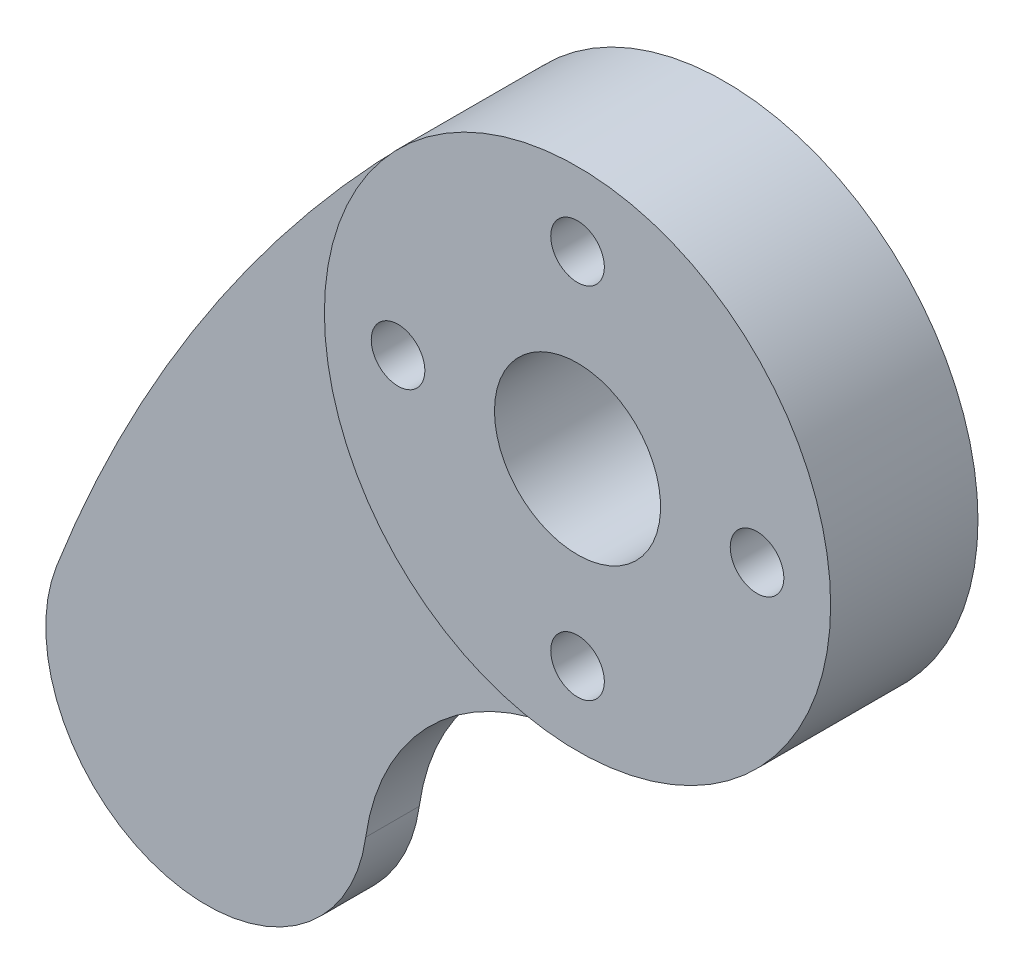
ISO-10303-21;
HEADER;
FILE_DESCRIPTION(('STEP AP214'),'2;1');
FILE_NAME('part.step','',(''),(''),'','','');
FILE_SCHEMA(('AUTOMOTIVE_DESIGN { 1 0 10303 214 1 1 1 1 }'));
ENDSEC;
DATA;
#1=APPLICATION_CONTEXT('core data for automotive mechanical design processes');
#2=APPLICATION_PROTOCOL_DEFINITION('international standard','automotive_design',2000,#1);
#3=PRODUCT_CONTEXT('',#1,'mechanical');
#4=PRODUCT('Part','Part','',(#3));
#5=PRODUCT_RELATED_PRODUCT_CATEGORY('part','',(#4));
#6=PRODUCT_DEFINITION_FORMATION('','',#4);
#7=PRODUCT_DEFINITION_CONTEXT('part definition',#1,'design');
#8=PRODUCT_DEFINITION('design','',#6,#7);
#9=PRODUCT_DEFINITION_SHAPE('','',#8);
#10=(LENGTH_UNIT() NAMED_UNIT(*) SI_UNIT(.MILLI.,.METRE.));
#11=(NAMED_UNIT(*) PLANE_ANGLE_UNIT() SI_UNIT($,.RADIAN.));
#12=(NAMED_UNIT(*) SI_UNIT($,.STERADIAN.) SOLID_ANGLE_UNIT());
#13=UNCERTAINTY_MEASURE_WITH_UNIT(LENGTH_MEASURE(1.E-05),#10,'distance_accuracy_value','');
#14=(GEOMETRIC_REPRESENTATION_CONTEXT(3) GLOBAL_UNCERTAINTY_ASSIGNED_CONTEXT((#13)) GLOBAL_UNIT_ASSIGNED_CONTEXT((#10,
#11,#12)) REPRESENTATION_CONTEXT('',''));
#15=CARTESIAN_POINT('',(0.,0.,0.));
#16=DIRECTION('',(0.,0.,1.));
#17=DIRECTION('',(1.,0.,0.));
#18=AXIS2_PLACEMENT_3D('',#15,#16,#17);
#19=CARTESIAN_POINT('',(0.,0.,3.175));
#20=DIRECTION('',(0.,0.,1.));
#21=DIRECTION('',(1.,0.,0.));
#22=AXIS2_PLACEMENT_3D('',#19,#20,#21);
#23=PLANE('',#22);
#24=CARTESIAN_POINT('',(104.489250000002,43.4974999999998,3.175));
#25=DIRECTION('',(0.,0.,1.));
#26=DIRECTION('',(1.,0.,0.));
#27=AXIS2_PLACEMENT_3D('',#24,#25,#26);
#28=CIRCLE('',#27,1.26999999998563);
#29=CARTESIAN_POINT('',(103.219250000017,43.4974999999998,3.175));
#30=VERTEX_POINT('',#29);
#31=EDGE_CURVE('E140',#30,#30,#28,.T.);
#32=ORIENTED_EDGE('',*,*,#31,.F.);
#33=EDGE_LOOP('',(#32));
#34=FACE_BOUND('',#33,.T.);
#35=CARTESIAN_POINT('',(104.489250000002,60.5154999999998,3.175));
#36=DIRECTION('',(0.,0.,1.));
#37=DIRECTION('',(1.,0.,0.));
#38=AXIS2_PLACEMENT_3D('',#35,#36,#37);
#39=CIRCLE('',#38,1.26999999998563);
#40=CARTESIAN_POINT('',(103.219250000017,60.5154999999998,3.175));
#41=VERTEX_POINT('',#40);
#42=EDGE_CURVE('E134',#41,#41,#39,.T.);
#43=ORIENTED_EDGE('',*,*,#42,.F.);
#44=EDGE_LOOP('',(#43));
#45=FACE_BOUND('',#44,.T.);
#46=CARTESIAN_POINT('',(95.9802500000022,52.0064999999998,3.175));
#47=DIRECTION('',(0.,0.,1.));
#48=DIRECTION('',(1.,0.,0.));
#49=AXIS2_PLACEMENT_3D('',#46,#47,#48);
#50=CIRCLE('',#49,1.26999999998564);
#51=CARTESIAN_POINT('',(94.7102500000166,52.0064999999998,3.175));
#52=VERTEX_POINT('',#51);
#53=EDGE_CURVE('E128',#52,#52,#50,.T.);
#54=ORIENTED_EDGE('',*,*,#53,.F.);
#55=EDGE_LOOP('',(#54));
#56=FACE_BOUND('',#55,.T.);
#57=CARTESIAN_POINT('',(112.998250000002,52.0064999999998,3.175));
#58=DIRECTION('',(0.,0.,1.));
#59=DIRECTION('',(1.,0.,0.));
#60=AXIS2_PLACEMENT_3D('',#57,#58,#59);
#61=CIRCLE('',#60,1.26999999998566);
#62=CARTESIAN_POINT('',(111.728250000017,52.0064999999998,3.175));
#63=VERTEX_POINT('',#62);
#64=EDGE_CURVE('E122',#63,#63,#61,.T.);
#65=ORIENTED_EDGE('',*,*,#64,.F.);
#66=EDGE_LOOP('',(#65));
#67=FACE_BOUND('',#66,.T.);
#68=CARTESIAN_POINT('',(104.489250000002,52.0064999999998,3.175));
#69=DIRECTION('',(0.,0.,1.));
#70=DIRECTION('',(1.,0.,0.));
#71=AXIS2_PLACEMENT_3D('',#68,#69,#70);
#72=CIRCLE('',#71,3.93699999998565);
#73=CARTESIAN_POINT('',(100.552250000017,52.0064999999998,3.175));
#74=VERTEX_POINT('',#73);
#75=EDGE_CURVE('E112',#74,#74,#72,.T.);
#76=ORIENTED_EDGE('',*,*,#75,.F.);
#77=EDGE_LOOP('',(#76));
#78=FACE_BOUND('',#77,.T.);
#79=CARTESIAN_POINT('',(104.489250000002,52.0064999999998,3.175));
#80=DIRECTION('',(0.,0.,1.));
#81=DIRECTION('',(1.,0.,0.));
#82=AXIS2_PLACEMENT_3D('',#79,#80,#81);
#83=CIRCLE('',#82,12.);
#84=CARTESIAN_POINT('',(116.489250000002,52.0064999999998,3.175));
#85=VERTEX_POINT('',#84);
#86=EDGE_CURVE('E94',#85,#85,#83,.T.);
#87=ORIENTED_EDGE('',*,*,#86,.T.);
#88=EDGE_LOOP('',(#87));
#89=FACE_BOUND('',#88,.T.);
#90=ADVANCED_FACE('F34',(#34,#45,#56,#67,#78,#89),#23,.T.);
#91=CARTESIAN_POINT('',(86.267181183115,31.8764422805925,3.175));
#92=DIRECTION('',(0.,0.,-1.));
#93=DIRECTION('',(-1.,0.,0.));
#94=AXIS2_PLACEMENT_3D('',#91,#92,#93);
#95=CYLINDRICAL_SURFACE('',#94,7.62);
#96=CARTESIAN_POINT('',(86.267181183115,31.8764422805925,2.54));
#97=DIRECTION('',(0.,0.,1.));
#98=DIRECTION('',(1.,0.,0.));
#99=AXIS2_PLACEMENT_3D('',#96,#97,#98);
#100=CIRCLE('',#99,7.62);
#101=CARTESIAN_POINT('',(79.1569800917538,34.6167781068018,2.54));
#102=VERTEX_POINT('',#101);
#103=CARTESIAN_POINT('',(93.8134639801699,30.8190795486629,2.54));
#104=VERTEX_POINT('',#103);
#105=EDGE_CURVE('E50',#102,#104,#100,.T.);
#106=ORIENTED_EDGE('',*,*,#105,.F.);
#107=DIRECTION('',(0.,0.,-1.));
#108=VECTOR('',#107,1.);
#109=CARTESIAN_POINT('',(79.1569800917538,34.6167781068018,3.175));
#110=LINE('',#109,#108);
#111=CARTESIAN_POINT('',(79.1569800917538,34.6167781068018,0.));
#112=VERTEX_POINT('',#111);
#113=EDGE_CURVE('E88',#102,#112,#110,.T.);
#114=ORIENTED_EDGE('',*,*,#113,.T.);
#115=CARTESIAN_POINT('',(86.267181183115,31.8764422805925,0.));
#116=DIRECTION('',(0.,0.,1.));
#117=DIRECTION('',(1.,0.,0.));
#118=AXIS2_PLACEMENT_3D('',#115,#116,#117);
#119=CIRCLE('',#118,7.62);
#120=CARTESIAN_POINT('',(93.8134639801699,30.8190795486629,0.));
#121=VERTEX_POINT('',#120);
#122=EDGE_CURVE('E102',#112,#121,#119,.T.);
#123=ORIENTED_EDGE('',*,*,#122,.T.);
#124=DIRECTION('',(0.,0.,-1.));
#125=VECTOR('',#124,1.);
#126=CARTESIAN_POINT('',(93.8134639801699,30.8190795486629,3.175025));
#127=LINE('',#126,#125);
#128=EDGE_CURVE('E57',#104,#121,#127,.T.);
#129=ORIENTED_EDGE('',*,*,#128,.F.);
#130=EDGE_LOOP('',(#106,#114,#123,#129));
#131=FACE_BOUND('',#130,.T.);
#132=ADVANCED_FACE('F36',(#131),#95,.T.);
#133=CARTESIAN_POINT('',(148.495405809727,7.8931215341666,3.175));
#134=DIRECTION('',(0.,0.,-1.));
#135=DIRECTION('',(-1.,0.,0.));
#136=AXIS2_PLACEMENT_3D('',#133,#134,#135);
#137=CYLINDRICAL_SURFACE('',#136,74.3099663683076);
#138=CARTESIAN_POINT('',(148.495405809727,7.8931215341666,2.54));
#139=DIRECTION('',(0.,0.,1.));
#140=DIRECTION('',(1.,0.,0.));
#141=AXIS2_PLACEMENT_3D('',#138,#139,#140);
#142=CIRCLE('',#141,74.3099663683076);
#143=CARTESIAN_POINT('',(96.0142996751163,60.5020998605583,2.54));
#144=VERTEX_POINT('',#143);
#145=EDGE_CURVE('E78',#144,#102,#142,.T.);
#146=ORIENTED_EDGE('',*,*,#145,.F.);
#147=DIRECTION('',(0.,0.,-1.));
#148=VECTOR('',#147,1.);
#149=CARTESIAN_POINT('',(96.0142996751162,60.5020998605583,3.175));
#150=LINE('',#149,#148);
#151=CARTESIAN_POINT('',(96.0142996751322,60.5020998605423,0.));
#152=VERTEX_POINT('',#151);
#153=EDGE_CURVE('E38',#144,#152,#150,.T.);
#154=ORIENTED_EDGE('',*,*,#153,.T.);
#155=CARTESIAN_POINT('',(148.495405809727,7.8931215341666,0.));
#156=DIRECTION('',(0.,0.,1.));
#157=DIRECTION('',(1.,0.,0.));
#158=AXIS2_PLACEMENT_3D('',#155,#156,#157);
#159=CIRCLE('',#158,74.3099663683076);
#160=EDGE_CURVE('E98',#152,#112,#159,.T.);
#161=ORIENTED_EDGE('',*,*,#160,.T.);
#162=ORIENTED_EDGE('',*,*,#113,.F.);
#163=EDGE_LOOP('',(#146,#154,#161,#162));
#164=FACE_BOUND('',#163,.T.);
#165=ADVANCED_FACE('F86',(#164),#137,.T.);
#166=CARTESIAN_POINT('',(104.378259896047,29.3387717239614,3.175025));
#167=DIRECTION('',(0.,0.,-1.));
#168=DIRECTION('',(-1.,0.,0.));
#169=AXIS2_PLACEMENT_3D('',#166,#167,#168);
#170=CYLINDRICAL_SURFACE('',#169,10.668);
#171=CARTESIAN_POINT('',(104.378259896047,29.3387717239614,2.54));
#172=DIRECTION('',(0.,0.,1.));
#173=DIRECTION('',(1.,0.,0.));
#174=AXIS2_PLACEMENT_3D('',#171,#172,#173);
#175=CIRCLE('',#174,10.668);
#176=CARTESIAN_POINT('',(104.430493989438,40.0066438453944,2.54));
#177=VERTEX_POINT('',#176);
#178=EDGE_CURVE('E79',#104,#177,#175,.F.);
#179=ORIENTED_EDGE('',*,*,#178,.F.);
#180=ORIENTED_EDGE('',*,*,#128,.T.);
#181=CARTESIAN_POINT('',(104.378259896047,29.3387717239614,0.));
#182=DIRECTION('',(0.,0.,-1.));
#183=DIRECTION('',(-1.,0.,0.));
#184=AXIS2_PLACEMENT_3D('',#181,#182,#183);
#185=CIRCLE('',#184,10.668);
#186=CARTESIAN_POINT('',(104.430493989438,40.0066438454166,0.));
#187=VERTEX_POINT('',#186);
#188=EDGE_CURVE('E148',#121,#187,#185,.T.);
#189=ORIENTED_EDGE('',*,*,#188,.T.);
#190=DIRECTION('',(0.,0.,-1.));
#191=VECTOR('',#190,1.);
#192=CARTESIAN_POINT('',(104.430493989438,40.0066438454166,3.175025));
#193=LINE('',#192,#191);
#194=EDGE_CURVE('E146',#177,#187,#193,.T.);
#195=ORIENTED_EDGE('',*,*,#194,.F.);
#196=EDGE_LOOP('',(#179,#180,#189,#195));
#197=FACE_BOUND('',#196,.T.);
#198=ADVANCED_FACE('F152',(#197),#170,.F.);
#199=CARTESIAN_POINT('',(0.,0.,0.));
#200=DIRECTION('',(0.,0.,1.));
#201=DIRECTION('',(1.,0.,0.));
#202=AXIS2_PLACEMENT_3D('',#199,#200,#201);
#203=PLANE('',#202);
#204=ORIENTED_EDGE('',*,*,#188,.F.);
#205=ORIENTED_EDGE('',*,*,#122,.F.);
#206=ORIENTED_EDGE('',*,*,#160,.F.);
#207=CARTESIAN_POINT('',(104.489250000002,52.0064999999998,0.));
#208=DIRECTION('',(0.,0.,-1.));
#209=DIRECTION('',(-1.,0.,0.));
#210=AXIS2_PLACEMENT_3D('',#207,#208,#209);
#211=CIRCLE('',#210,11.9999999999777);
#212=EDGE_CURVE('E11',#187,#152,#211,.T.);
#213=ORIENTED_EDGE('',*,*,#212,.F.);
#214=EDGE_LOOP('',(#204,#205,#206,#213));
#215=FACE_BOUND('',#214,.T.);
#216=ADVANCED_FACE('F154',(#215),#203,.F.);
#217=CARTESIAN_POINT('',(104.489250000002,52.0064999999998,3.175));
#218=DIRECTION('',(0.,0.,-1.));
#219=DIRECTION('',(-1.,0.,0.));
#220=AXIS2_PLACEMENT_3D('',#217,#218,#219);
#221=CYLINDRICAL_SURFACE('',#220,12.);
#222=ORIENTED_EDGE('',*,*,#153,.F.);
#223=CARTESIAN_POINT('',(104.489250000002,52.0064999999998,2.54));
#224=DIRECTION('',(0.,0.,1.));
#225=DIRECTION('',(1.,0.,0.));
#226=AXIS2_PLACEMENT_3D('',#223,#224,#225);
#227=CIRCLE('',#226,11.9999999999889);
#228=EDGE_CURVE('E75',#144,#177,#227,.T.);
#229=ORIENTED_EDGE('',*,*,#228,.T.);
#230=ORIENTED_EDGE('',*,*,#194,.T.);
#231=ORIENTED_EDGE('',*,*,#212,.T.);
#232=EDGE_LOOP('',(#222,#229,#230,#231));
#233=FACE_BOUND('',#232,.T.);
#234=ORIENTED_EDGE('',*,*,#86,.F.);
#235=EDGE_LOOP('',(#234));
#236=FACE_BOUND('',#235,.T.);
#237=CARTESIAN_POINT('',(104.489250000002,52.0064999999998,-3.81));
#238=DIRECTION('',(0.,0.,-1.));
#239=DIRECTION('',(-1.,0.,0.));
#240=AXIS2_PLACEMENT_3D('',#237,#238,#239);
#241=CIRCLE('',#240,11.9999999999777);
#242=CARTESIAN_POINT('',(92.4892500000245,52.0064999999998,-3.81));
#243=VERTEX_POINT('',#242);
#244=EDGE_CURVE('E109',#243,#243,#241,.T.);
#245=ORIENTED_EDGE('',*,*,#244,.F.);
#246=EDGE_LOOP('',(#245));
#247=FACE_BOUND('',#246,.T.);
#248=ADVANCED_FACE('F90',(#233,#236,#247),#221,.T.);
#249=CARTESIAN_POINT('',(104.489250000002,52.0064999999998,-3.81));
#250=DIRECTION('',(0.,0.,-1.));
#251=DIRECTION('',(-1.,0.,0.));
#252=AXIS2_PLACEMENT_3D('',#249,#250,#251);
#253=PLANE('',#252);
#254=CARTESIAN_POINT('',(104.489250000002,43.4974999999998,-3.81));
#255=DIRECTION('',(0.,0.,-1.));
#256=DIRECTION('',(-1.,0.,0.));
#257=AXIS2_PLACEMENT_3D('',#254,#255,#256);
#258=CIRCLE('',#257,1.26999999998563);
#259=CARTESIAN_POINT('',(103.219250000017,43.4974999999998,-3.81));
#260=VERTEX_POINT('',#259);
#261=EDGE_CURVE('E143',#260,#260,#258,.T.);
#262=ORIENTED_EDGE('',*,*,#261,.F.);
#263=EDGE_LOOP('',(#262));
#264=FACE_BOUND('',#263,.T.);
#265=CARTESIAN_POINT('',(104.489250000002,60.5154999999998,-3.81));
#266=DIRECTION('',(0.,0.,-1.));
#267=DIRECTION('',(-1.,0.,0.));
#268=AXIS2_PLACEMENT_3D('',#265,#266,#267);
#269=CIRCLE('',#268,1.26999999998563);
#270=CARTESIAN_POINT('',(103.219250000017,60.5154999999998,-3.81));
#271=VERTEX_POINT('',#270);
#272=EDGE_CURVE('E137',#271,#271,#269,.T.);
#273=ORIENTED_EDGE('',*,*,#272,.F.);
#274=EDGE_LOOP('',(#273));
#275=FACE_BOUND('',#274,.T.);
#276=CARTESIAN_POINT('',(95.9802500000022,52.0064999999998,-3.81));
#277=DIRECTION('',(0.,0.,-1.));
#278=DIRECTION('',(-1.,0.,0.));
#279=AXIS2_PLACEMENT_3D('',#276,#277,#278);
#280=CIRCLE('',#279,1.26999999998564);
#281=CARTESIAN_POINT('',(94.7102500000166,52.0064999999998,-3.81));
#282=VERTEX_POINT('',#281);
#283=EDGE_CURVE('E131',#282,#282,#280,.T.);
#284=ORIENTED_EDGE('',*,*,#283,.F.);
#285=EDGE_LOOP('',(#284));
#286=FACE_BOUND('',#285,.T.);
#287=CARTESIAN_POINT('',(112.998250000002,52.0064999999998,-3.81));
#288=DIRECTION('',(0.,0.,-1.));
#289=DIRECTION('',(-1.,0.,0.));
#290=AXIS2_PLACEMENT_3D('',#287,#288,#289);
#291=CIRCLE('',#290,1.26999999998566);
#292=CARTESIAN_POINT('',(111.728250000017,52.0064999999998,-3.81));
#293=VERTEX_POINT('',#292);
#294=EDGE_CURVE('E125',#293,#293,#291,.T.);
#295=ORIENTED_EDGE('',*,*,#294,.F.);
#296=EDGE_LOOP('',(#295));
#297=FACE_BOUND('',#296,.T.);
#298=CARTESIAN_POINT('',(104.489250000002,52.0064999999998,-3.81));
#299=DIRECTION('',(0.,0.,-1.));
#300=DIRECTION('',(-1.,0.,0.));
#301=AXIS2_PLACEMENT_3D('',#298,#299,#300);
#302=CIRCLE('',#301,3.93699999998565);
#303=CARTESIAN_POINT('',(100.552250000017,52.0064999999998,-3.81));
#304=VERTEX_POINT('',#303);
#305=EDGE_CURVE('E117',#304,#304,#302,.T.);
#306=ORIENTED_EDGE('',*,*,#305,.F.);
#307=EDGE_LOOP('',(#306));
#308=FACE_BOUND('',#307,.T.);
#309=ORIENTED_EDGE('',*,*,#244,.T.);
#310=EDGE_LOOP('',(#309));
#311=FACE_BOUND('',#310,.T.);
#312=ADVANCED_FACE('F161',(#264,#275,#286,#297,#308,#311),#253,.T.);
#313=CARTESIAN_POINT('',(104.489250000002,52.0064999999998,3.175025));
#314=DIRECTION('',(0.,0.,-1.));
#315=DIRECTION('',(-1.,0.,0.));
#316=AXIS2_PLACEMENT_3D('',#313,#314,#315);
#317=CYLINDRICAL_SURFACE('',#316,3.93699999998565);
#318=CARTESIAN_POINT('',(100.552250000017,52.0064999999998,3.175));
#319=CARTESIAN_POINT('',(100.552250000017,52.0064999999998,3.10223958333333));
#320=CARTESIAN_POINT('',(100.552250000017,52.0064999999998,3.02947916666667));
#321=CARTESIAN_POINT('',(100.552250000017,52.0064999999998,2.88395833333333));
#322=CARTESIAN_POINT('',(100.552250000017,52.0064999999998,2.81119791666667));
#323=CARTESIAN_POINT('',(100.552250000017,52.0064999999998,2.66567708333333));
#324=CARTESIAN_POINT('',(100.552250000017,52.0064999999998,2.59291666666667));
#325=CARTESIAN_POINT('',(100.552250000017,52.0064999999998,2.44739583333333));
#326=CARTESIAN_POINT('',(100.552250000017,52.0064999999998,2.37463541666667));
#327=CARTESIAN_POINT('',(100.552250000017,52.0064999999998,2.22911458333333));
#328=CARTESIAN_POINT('',(100.552250000017,52.0064999999998,2.15635416666667));
#329=CARTESIAN_POINT('',(100.552250000017,52.0064999999998,2.01083333333333));
#330=CARTESIAN_POINT('',(100.552250000017,52.0064999999998,1.93807291666667));
#331=CARTESIAN_POINT('',(100.552250000017,52.0064999999998,1.79255208333333));
#332=CARTESIAN_POINT('',(100.552250000017,52.0064999999998,1.71979166666667));
#333=CARTESIAN_POINT('',(100.552250000017,52.0064999999998,1.57427083333333));
#334=CARTESIAN_POINT('',(100.552250000017,52.0064999999998,1.50151041666667));
#335=CARTESIAN_POINT('',(100.552250000017,52.0064999999998,1.35598958333333));
#336=CARTESIAN_POINT('',(100.552250000017,52.0064999999998,1.28322916666667));
#337=CARTESIAN_POINT('',(100.552250000017,52.0064999999998,1.13770833333333));
#338=CARTESIAN_POINT('',(100.552250000017,52.0064999999998,1.06494791666667));
#339=CARTESIAN_POINT('',(100.552250000017,52.0064999999998,0.919427083333334));
#340=CARTESIAN_POINT('',(100.552250000017,52.0064999999998,0.846666666666667));
#341=CARTESIAN_POINT('',(100.552250000017,52.0064999999998,0.701145833333334));
#342=CARTESIAN_POINT('',(100.552250000017,52.0064999999998,0.628385416666667));
#343=CARTESIAN_POINT('',(100.552250000017,52.0064999999998,0.482864583333334));
#344=CARTESIAN_POINT('',(100.552250000017,52.0064999999998,0.410104166666667));
#345=CARTESIAN_POINT('',(100.552250000017,52.0064999999998,0.264583333333334));
#346=CARTESIAN_POINT('',(100.552250000017,52.0064999999998,0.191822916666667));
#347=CARTESIAN_POINT('',(100.552250000017,52.0064999999998,0.0463020833333337));
#348=CARTESIAN_POINT('',(100.552250000017,52.0064999999998,-0.0264583333333329));
#349=CARTESIAN_POINT('',(100.552250000017,52.0064999999998,-0.171979166666666));
#350=CARTESIAN_POINT('',(100.552250000017,52.0064999999998,-0.244739583333333));
#351=CARTESIAN_POINT('',(100.552250000017,52.0064999999998,-0.390260416666666));
#352=CARTESIAN_POINT('',(100.552250000017,52.0064999999998,-0.463020833333333));
#353=CARTESIAN_POINT('',(100.552250000017,52.0064999999998,-0.608541666666666));
#354=CARTESIAN_POINT('',(100.552250000017,52.0064999999998,-0.681302083333333));
#355=CARTESIAN_POINT('',(100.552250000017,52.0064999999998,-0.826822916666666));
#356=CARTESIAN_POINT('',(100.552250000017,52.0064999999998,-0.899583333333332));
#357=CARTESIAN_POINT('',(100.552250000017,52.0064999999998,-1.04510416666667));
#358=CARTESIAN_POINT('',(100.552250000017,52.0064999999998,-1.11786458333333));
#359=CARTESIAN_POINT('',(100.552250000017,52.0064999999998,-1.26338541666667));
#360=CARTESIAN_POINT('',(100.552250000017,52.0064999999998,-1.33614583333333));
#361=CARTESIAN_POINT('',(100.552250000017,52.0064999999998,-1.48166666666667));
#362=CARTESIAN_POINT('',(100.552250000017,52.0064999999998,-1.55442708333333));
#363=CARTESIAN_POINT('',(100.552250000017,52.0064999999998,-1.69994791666667));
#364=CARTESIAN_POINT('',(100.552250000017,52.0064999999998,-1.77270833333333));
#365=CARTESIAN_POINT('',(100.552250000017,52.0064999999998,-1.91822916666667));
#366=CARTESIAN_POINT('',(100.552250000017,52.0064999999998,-1.99098958333333));
#367=CARTESIAN_POINT('',(100.552250000017,52.0064999999998,-2.13651041666667));
#368=CARTESIAN_POINT('',(100.552250000017,52.0064999999998,-2.20927083333333));
#369=CARTESIAN_POINT('',(100.552250000017,52.0064999999998,-2.35479166666667));
#370=CARTESIAN_POINT('',(100.552250000017,52.0064999999998,-2.42755208333333));
#371=CARTESIAN_POINT('',(100.552250000017,52.0064999999998,-2.57307291666667));
#372=CARTESIAN_POINT('',(100.552250000017,52.0064999999998,-2.64583333333333));
#373=CARTESIAN_POINT('',(100.552250000017,52.0064999999998,-2.79135416666667));
#374=CARTESIAN_POINT('',(100.552250000017,52.0064999999998,-2.86411458333333));
#375=CARTESIAN_POINT('',(100.552250000017,52.0064999999998,-3.00963541666667));
#376=CARTESIAN_POINT('',(100.552250000017,52.0064999999998,-3.08239583333333));
#377=CARTESIAN_POINT('',(100.552250000017,52.0064999999998,-3.22791666666667));
#378=CARTESIAN_POINT('',(100.552250000017,52.0064999999998,-3.30067708333333));
#379=CARTESIAN_POINT('',(100.552250000017,52.0064999999998,-3.44619791666666));
#380=CARTESIAN_POINT('',(100.552250000017,52.0064999999998,-3.51895833333333));
#381=CARTESIAN_POINT('',(100.552250000017,52.0064999999998,-3.66447916666667));
#382=CARTESIAN_POINT('',(100.552250000017,52.0064999999998,-3.73723958333333));
#383=CARTESIAN_POINT('',(100.552250000017,52.0064999999998,-3.81));
#384=B_SPLINE_CURVE_WITH_KNOTS('',3,(#318,#319,#320,#321,#322,#323,#324,#325,#326,#327,#328,
#329,#330,#331,#332,#333,#334,#335,#336,#337,#338,#339,#340,#341,#342,#343,#344,#345,#346,#347,
#348,#349,#350,#351,#352,#353,#354,#355,#356,#357,#358,#359,#360,#361,#362,#363,#364,#365,#366,
#367,#368,#369,#370,#371,#372,#373,#374,#375,#376,#377,#378,#379,#380,#381,#382,#383),
.UNSPECIFIED.,.F.,.F.,(4,2,2,2,2,2,2,2,2,2,2,2,2,2,2,2,2,2,2,2,2,2,2,2,2,2,2,2,2,2,2,2,4),(0.,
0.21828125,0.4365625,0.65484375,0.873124999999999,1.09140625,1.3096875,1.52796875,1.74625,
1.96453125,2.1828125,2.40109375,2.619375,2.83765625,3.0559375,3.27421875,3.4925,3.71078125,
3.9290625,4.14734375,4.365625,4.58390625,4.8021875,5.02046875,5.23875,5.45703125,5.6753125,
5.89359375,6.111875,6.33015625,6.5484375,6.76671875,6.985),.UNSPECIFIED.);
#385=EDGE_CURVE('BSEAM175',#74,#304,#384,.T.);
#386=ORIENTED_EDGE('',*,*,#75,.T.);
#387=ORIENTED_EDGE('',*,*,#305,.T.);
#388=ORIENTED_EDGE('',*,*,#385,.T.);
#389=ORIENTED_EDGE('',*,*,#385,.F.);
#390=EDGE_LOOP('',(#386,#388,#387,#389));
#391=FACE_BOUND('',#390,.T.);
#392=ADVANCED_FACE('F175',(#391),#317,.F.);
#393=CARTESIAN_POINT('',(112.998250000002,52.0064999999998,3.175025));
#394=DIRECTION('',(0.,0.,-1.));
#395=DIRECTION('',(-1.,0.,0.));
#396=AXIS2_PLACEMENT_3D('',#393,#394,#395);
#397=CYLINDRICAL_SURFACE('',#396,1.26999999998566);
#398=CARTESIAN_POINT('',(111.728250000017,52.0064999999998,3.175));
#399=CARTESIAN_POINT('',(111.728250000017,52.0064999999998,3.10223958333333));
#400=CARTESIAN_POINT('',(111.728250000017,52.0064999999998,3.02947916666667));
#401=CARTESIAN_POINT('',(111.728250000017,52.0064999999998,2.88395833333333));
#402=CARTESIAN_POINT('',(111.728250000017,52.0064999999998,2.81119791666667));
#403=CARTESIAN_POINT('',(111.728250000017,52.0064999999998,2.66567708333333));
#404=CARTESIAN_POINT('',(111.728250000017,52.0064999999998,2.59291666666667));
#405=CARTESIAN_POINT('',(111.728250000017,52.0064999999998,2.44739583333333));
#406=CARTESIAN_POINT('',(111.728250000017,52.0064999999998,2.37463541666667));
#407=CARTESIAN_POINT('',(111.728250000017,52.0064999999998,2.22911458333333));
#408=CARTESIAN_POINT('',(111.728250000017,52.0064999999998,2.15635416666667));
#409=CARTESIAN_POINT('',(111.728250000017,52.0064999999998,2.01083333333333));
#410=CARTESIAN_POINT('',(111.728250000017,52.0064999999998,1.93807291666667));
#411=CARTESIAN_POINT('',(111.728250000017,52.0064999999998,1.79255208333333));
#412=CARTESIAN_POINT('',(111.728250000017,52.0064999999998,1.71979166666667));
#413=CARTESIAN_POINT('',(111.728250000017,52.0064999999998,1.57427083333333));
#414=CARTESIAN_POINT('',(111.728250000017,52.0064999999998,1.50151041666667));
#415=CARTESIAN_POINT('',(111.728250000017,52.0064999999998,1.35598958333333));
#416=CARTESIAN_POINT('',(111.728250000017,52.0064999999998,1.28322916666667));
#417=CARTESIAN_POINT('',(111.728250000017,52.0064999999998,1.13770833333333));
#418=CARTESIAN_POINT('',(111.728250000017,52.0064999999998,1.06494791666667));
#419=CARTESIAN_POINT('',(111.728250000017,52.0064999999998,0.919427083333334));
#420=CARTESIAN_POINT('',(111.728250000017,52.0064999999998,0.846666666666667));
#421=CARTESIAN_POINT('',(111.728250000017,52.0064999999998,0.701145833333334));
#422=CARTESIAN_POINT('',(111.728250000017,52.0064999999998,0.628385416666667));
#423=CARTESIAN_POINT('',(111.728250000017,52.0064999999998,0.482864583333334));
#424=CARTESIAN_POINT('',(111.728250000017,52.0064999999998,0.410104166666667));
#425=CARTESIAN_POINT('',(111.728250000017,52.0064999999998,0.264583333333334));
#426=CARTESIAN_POINT('',(111.728250000017,52.0064999999998,0.191822916666667));
#427=CARTESIAN_POINT('',(111.728250000017,52.0064999999998,0.0463020833333337));
#428=CARTESIAN_POINT('',(111.728250000017,52.0064999999998,-0.0264583333333329));
#429=CARTESIAN_POINT('',(111.728250000017,52.0064999999998,-0.171979166666666));
#430=CARTESIAN_POINT('',(111.728250000017,52.0064999999998,-0.244739583333333));
#431=CARTESIAN_POINT('',(111.728250000017,52.0064999999998,-0.390260416666666));
#432=CARTESIAN_POINT('',(111.728250000017,52.0064999999998,-0.463020833333333));
#433=CARTESIAN_POINT('',(111.728250000017,52.0064999999998,-0.608541666666666));
#434=CARTESIAN_POINT('',(111.728250000017,52.0064999999998,-0.681302083333333));
#435=CARTESIAN_POINT('',(111.728250000017,52.0064999999998,-0.826822916666666));
#436=CARTESIAN_POINT('',(111.728250000017,52.0064999999998,-0.899583333333332));
#437=CARTESIAN_POINT('',(111.728250000017,52.0064999999998,-1.04510416666667));
#438=CARTESIAN_POINT('',(111.728250000017,52.0064999999998,-1.11786458333333));
#439=CARTESIAN_POINT('',(111.728250000017,52.0064999999998,-1.26338541666667));
#440=CARTESIAN_POINT('',(111.728250000017,52.0064999999998,-1.33614583333333));
#441=CARTESIAN_POINT('',(111.728250000017,52.0064999999998,-1.48166666666667));
#442=CARTESIAN_POINT('',(111.728250000017,52.0064999999998,-1.55442708333333));
#443=CARTESIAN_POINT('',(111.728250000017,52.0064999999998,-1.69994791666667));
#444=CARTESIAN_POINT('',(111.728250000017,52.0064999999998,-1.77270833333333));
#445=CARTESIAN_POINT('',(111.728250000017,52.0064999999998,-1.91822916666667));
#446=CARTESIAN_POINT('',(111.728250000017,52.0064999999998,-1.99098958333333));
#447=CARTESIAN_POINT('',(111.728250000017,52.0064999999998,-2.13651041666667));
#448=CARTESIAN_POINT('',(111.728250000017,52.0064999999998,-2.20927083333333));
#449=CARTESIAN_POINT('',(111.728250000017,52.0064999999998,-2.35479166666667));
#450=CARTESIAN_POINT('',(111.728250000017,52.0064999999998,-2.42755208333333));
#451=CARTESIAN_POINT('',(111.728250000017,52.0064999999998,-2.57307291666667));
#452=CARTESIAN_POINT('',(111.728250000017,52.0064999999998,-2.64583333333333));
#453=CARTESIAN_POINT('',(111.728250000017,52.0064999999998,-2.79135416666667));
#454=CARTESIAN_POINT('',(111.728250000017,52.0064999999998,-2.86411458333333));
#455=CARTESIAN_POINT('',(111.728250000017,52.0064999999998,-3.00963541666667));
#456=CARTESIAN_POINT('',(111.728250000017,52.0064999999998,-3.08239583333333));
#457=CARTESIAN_POINT('',(111.728250000017,52.0064999999998,-3.22791666666667));
#458=CARTESIAN_POINT('',(111.728250000017,52.0064999999998,-3.30067708333333));
#459=CARTESIAN_POINT('',(111.728250000017,52.0064999999998,-3.44619791666666));
#460=CARTESIAN_POINT('',(111.728250000017,52.0064999999998,-3.51895833333333));
#461=CARTESIAN_POINT('',(111.728250000017,52.0064999999998,-3.66447916666667));
#462=CARTESIAN_POINT('',(111.728250000017,52.0064999999998,-3.73723958333333));
#463=CARTESIAN_POINT('',(111.728250000017,52.0064999999998,-3.81));
#464=B_SPLINE_CURVE_WITH_KNOTS('',3,(#398,#399,#400,#401,#402,#403,#404,#405,#406,#407,#408,
#409,#410,#411,#412,#413,#414,#415,#416,#417,#418,#419,#420,#421,#422,#423,#424,#425,#426,#427,
#428,#429,#430,#431,#432,#433,#434,#435,#436,#437,#438,#439,#440,#441,#442,#443,#444,#445,#446,
#447,#448,#449,#450,#451,#452,#453,#454,#455,#456,#457,#458,#459,#460,#461,#462,#463),
.UNSPECIFIED.,.F.,.F.,(4,2,2,2,2,2,2,2,2,2,2,2,2,2,2,2,2,2,2,2,2,2,2,2,2,2,2,2,2,2,2,2,4),(0.,
0.21828125,0.4365625,0.65484375,0.873124999999999,1.09140625,1.3096875,1.52796875,1.74625,
1.96453125,2.1828125,2.40109375,2.619375,2.83765625,3.0559375,3.27421875,3.4925,3.71078125,
3.9290625,4.14734375,4.365625,4.58390625,4.8021875,5.02046875,5.23875,5.45703125,5.6753125,
5.89359375,6.111875,6.33015625,6.5484375,6.76671875,6.985),.UNSPECIFIED.);
#465=EDGE_CURVE('BSEAM179',#63,#293,#464,.T.);
#466=ORIENTED_EDGE('',*,*,#64,.T.);
#467=ORIENTED_EDGE('',*,*,#294,.T.);
#468=ORIENTED_EDGE('',*,*,#465,.T.);
#469=ORIENTED_EDGE('',*,*,#465,.F.);
#470=EDGE_LOOP('',(#466,#468,#467,#469));
#471=FACE_BOUND('',#470,.T.);
#472=ADVANCED_FACE('F179',(#471),#397,.F.);
#473=CARTESIAN_POINT('',(95.9802500000022,52.0064999999998,3.175025));
#474=DIRECTION('',(0.,0.,-1.));
#475=DIRECTION('',(-1.,0.,0.));
#476=AXIS2_PLACEMENT_3D('',#473,#474,#475);
#477=CYLINDRICAL_SURFACE('',#476,1.26999999998564);
#478=CARTESIAN_POINT('',(94.7102500000166,52.0064999999998,3.175));
#479=CARTESIAN_POINT('',(94.7102500000166,52.0064999999998,3.10223958333333));
#480=CARTESIAN_POINT('',(94.7102500000166,52.0064999999998,3.02947916666667));
#481=CARTESIAN_POINT('',(94.7102500000166,52.0064999999998,2.88395833333333));
#482=CARTESIAN_POINT('',(94.7102500000166,52.0064999999998,2.81119791666667));
#483=CARTESIAN_POINT('',(94.7102500000166,52.0064999999998,2.66567708333333));
#484=CARTESIAN_POINT('',(94.7102500000166,52.0064999999998,2.59291666666667));
#485=CARTESIAN_POINT('',(94.7102500000166,52.0064999999998,2.44739583333333));
#486=CARTESIAN_POINT('',(94.7102500000166,52.0064999999998,2.37463541666667));
#487=CARTESIAN_POINT('',(94.7102500000166,52.0064999999998,2.22911458333333));
#488=CARTESIAN_POINT('',(94.7102500000166,52.0064999999998,2.15635416666667));
#489=CARTESIAN_POINT('',(94.7102500000166,52.0064999999998,2.01083333333333));
#490=CARTESIAN_POINT('',(94.7102500000166,52.0064999999998,1.93807291666667));
#491=CARTESIAN_POINT('',(94.7102500000166,52.0064999999998,1.79255208333333));
#492=CARTESIAN_POINT('',(94.7102500000166,52.0064999999998,1.71979166666667));
#493=CARTESIAN_POINT('',(94.7102500000166,52.0064999999998,1.57427083333333));
#494=CARTESIAN_POINT('',(94.7102500000166,52.0064999999998,1.50151041666667));
#495=CARTESIAN_POINT('',(94.7102500000166,52.0064999999998,1.35598958333333));
#496=CARTESIAN_POINT('',(94.7102500000166,52.0064999999998,1.28322916666667));
#497=CARTESIAN_POINT('',(94.7102500000166,52.0064999999998,1.13770833333333));
#498=CARTESIAN_POINT('',(94.7102500000166,52.0064999999998,1.06494791666667));
#499=CARTESIAN_POINT('',(94.7102500000166,52.0064999999998,0.919427083333334));
#500=CARTESIAN_POINT('',(94.7102500000166,52.0064999999998,0.846666666666667));
#501=CARTESIAN_POINT('',(94.7102500000166,52.0064999999998,0.701145833333334));
#502=CARTESIAN_POINT('',(94.7102500000166,52.0064999999998,0.628385416666667));
#503=CARTESIAN_POINT('',(94.7102500000166,52.0064999999998,0.482864583333334));
#504=CARTESIAN_POINT('',(94.7102500000166,52.0064999999998,0.410104166666667));
#505=CARTESIAN_POINT('',(94.7102500000166,52.0064999999998,0.264583333333334));
#506=CARTESIAN_POINT('',(94.7102500000166,52.0064999999998,0.191822916666667));
#507=CARTESIAN_POINT('',(94.7102500000166,52.0064999999998,0.0463020833333337));
#508=CARTESIAN_POINT('',(94.7102500000166,52.0064999999998,-0.0264583333333329));
#509=CARTESIAN_POINT('',(94.7102500000166,52.0064999999998,-0.171979166666666));
#510=CARTESIAN_POINT('',(94.7102500000166,52.0064999999998,-0.244739583333333));
#511=CARTESIAN_POINT('',(94.7102500000166,52.0064999999998,-0.390260416666666));
#512=CARTESIAN_POINT('',(94.7102500000166,52.0064999999998,-0.463020833333333));
#513=CARTESIAN_POINT('',(94.7102500000166,52.0064999999998,-0.608541666666666));
#514=CARTESIAN_POINT('',(94.7102500000166,52.0064999999998,-0.681302083333333));
#515=CARTESIAN_POINT('',(94.7102500000166,52.0064999999998,-0.826822916666666));
#516=CARTESIAN_POINT('',(94.7102500000166,52.0064999999998,-0.899583333333332));
#517=CARTESIAN_POINT('',(94.7102500000166,52.0064999999998,-1.04510416666667));
#518=CARTESIAN_POINT('',(94.7102500000166,52.0064999999998,-1.11786458333333));
#519=CARTESIAN_POINT('',(94.7102500000166,52.0064999999998,-1.26338541666667));
#520=CARTESIAN_POINT('',(94.7102500000166,52.0064999999998,-1.33614583333333));
#521=CARTESIAN_POINT('',(94.7102500000166,52.0064999999998,-1.48166666666667));
#522=CARTESIAN_POINT('',(94.7102500000166,52.0064999999998,-1.55442708333333));
#523=CARTESIAN_POINT('',(94.7102500000166,52.0064999999998,-1.69994791666667));
#524=CARTESIAN_POINT('',(94.7102500000166,52.0064999999998,-1.77270833333333));
#525=CARTESIAN_POINT('',(94.7102500000166,52.0064999999998,-1.91822916666667));
#526=CARTESIAN_POINT('',(94.7102500000166,52.0064999999998,-1.99098958333333));
#527=CARTESIAN_POINT('',(94.7102500000166,52.0064999999998,-2.13651041666667));
#528=CARTESIAN_POINT('',(94.7102500000166,52.0064999999998,-2.20927083333333));
#529=CARTESIAN_POINT('',(94.7102500000166,52.0064999999998,-2.35479166666667));
#530=CARTESIAN_POINT('',(94.7102500000166,52.0064999999998,-2.42755208333333));
#531=CARTESIAN_POINT('',(94.7102500000166,52.0064999999998,-2.57307291666667));
#532=CARTESIAN_POINT('',(94.7102500000166,52.0064999999998,-2.64583333333333));
#533=CARTESIAN_POINT('',(94.7102500000166,52.0064999999998,-2.79135416666667));
#534=CARTESIAN_POINT('',(94.7102500000166,52.0064999999998,-2.86411458333333));
#535=CARTESIAN_POINT('',(94.7102500000166,52.0064999999998,-3.00963541666667));
#536=CARTESIAN_POINT('',(94.7102500000166,52.0064999999998,-3.08239583333333));
#537=CARTESIAN_POINT('',(94.7102500000166,52.0064999999998,-3.22791666666667));
#538=CARTESIAN_POINT('',(94.7102500000166,52.0064999999998,-3.30067708333333));
#539=CARTESIAN_POINT('',(94.7102500000166,52.0064999999998,-3.44619791666666));
#540=CARTESIAN_POINT('',(94.7102500000166,52.0064999999998,-3.51895833333333));
#541=CARTESIAN_POINT('',(94.7102500000166,52.0064999999998,-3.66447916666667));
#542=CARTESIAN_POINT('',(94.7102500000166,52.0064999999998,-3.73723958333333));
#543=CARTESIAN_POINT('',(94.7102500000166,52.0064999999998,-3.81));
#544=B_SPLINE_CURVE_WITH_KNOTS('',3,(#478,#479,#480,#481,#482,#483,#484,#485,#486,#487,#488,
#489,#490,#491,#492,#493,#494,#495,#496,#497,#498,#499,#500,#501,#502,#503,#504,#505,#506,#507,
#508,#509,#510,#511,#512,#513,#514,#515,#516,#517,#518,#519,#520,#521,#522,#523,#524,#525,#526,
#527,#528,#529,#530,#531,#532,#533,#534,#535,#536,#537,#538,#539,#540,#541,#542,#543),
.UNSPECIFIED.,.F.,.F.,(4,2,2,2,2,2,2,2,2,2,2,2,2,2,2,2,2,2,2,2,2,2,2,2,2,2,2,2,2,2,2,2,4),(0.,
0.21828125,0.4365625,0.65484375,0.873124999999999,1.09140625,1.3096875,1.52796875,1.74625,
1.96453125,2.1828125,2.40109375,2.619375,2.83765625,3.0559375,3.27421875,3.4925,3.71078125,
3.9290625,4.14734375,4.365625,4.58390625,4.8021875,5.02046875,5.23875,5.45703125,5.6753125,
5.89359375,6.111875,6.33015625,6.5484375,6.76671875,6.985),.UNSPECIFIED.);
#545=EDGE_CURVE('BSEAM183',#52,#282,#544,.T.);
#546=ORIENTED_EDGE('',*,*,#53,.T.);
#547=ORIENTED_EDGE('',*,*,#283,.T.);
#548=ORIENTED_EDGE('',*,*,#545,.T.);
#549=ORIENTED_EDGE('',*,*,#545,.F.);
#550=EDGE_LOOP('',(#546,#548,#547,#549));
#551=FACE_BOUND('',#550,.T.);
#552=ADVANCED_FACE('F183',(#551),#477,.F.);
#553=CARTESIAN_POINT('',(104.489250000002,60.5154999999998,3.175025));
#554=DIRECTION('',(0.,0.,-1.));
#555=DIRECTION('',(-1.,0.,0.));
#556=AXIS2_PLACEMENT_3D('',#553,#554,#555);
#557=CYLINDRICAL_SURFACE('',#556,1.26999999998563);
#558=CARTESIAN_POINT('',(103.219250000017,60.5154999999998,3.175));
#559=CARTESIAN_POINT('',(103.219250000017,60.5154999999998,3.10223958333333));
#560=CARTESIAN_POINT('',(103.219250000017,60.5154999999998,3.02947916666667));
#561=CARTESIAN_POINT('',(103.219250000017,60.5154999999998,2.88395833333333));
#562=CARTESIAN_POINT('',(103.219250000017,60.5154999999998,2.81119791666667));
#563=CARTESIAN_POINT('',(103.219250000017,60.5154999999998,2.66567708333333));
#564=CARTESIAN_POINT('',(103.219250000017,60.5154999999998,2.59291666666667));
#565=CARTESIAN_POINT('',(103.219250000017,60.5154999999998,2.44739583333333));
#566=CARTESIAN_POINT('',(103.219250000017,60.5154999999998,2.37463541666667));
#567=CARTESIAN_POINT('',(103.219250000017,60.5154999999998,2.22911458333333));
#568=CARTESIAN_POINT('',(103.219250000017,60.5154999999998,2.15635416666667));
#569=CARTESIAN_POINT('',(103.219250000017,60.5154999999998,2.01083333333333));
#570=CARTESIAN_POINT('',(103.219250000017,60.5154999999998,1.93807291666667));
#571=CARTESIAN_POINT('',(103.219250000017,60.5154999999998,1.79255208333333));
#572=CARTESIAN_POINT('',(103.219250000017,60.5154999999998,1.71979166666667));
#573=CARTESIAN_POINT('',(103.219250000017,60.5154999999998,1.57427083333333));
#574=CARTESIAN_POINT('',(103.219250000017,60.5154999999998,1.50151041666667));
#575=CARTESIAN_POINT('',(103.219250000017,60.5154999999998,1.35598958333333));
#576=CARTESIAN_POINT('',(103.219250000017,60.5154999999998,1.28322916666667));
#577=CARTESIAN_POINT('',(103.219250000017,60.5154999999998,1.13770833333333));
#578=CARTESIAN_POINT('',(103.219250000017,60.5154999999998,1.06494791666667));
#579=CARTESIAN_POINT('',(103.219250000017,60.5154999999998,0.919427083333334));
#580=CARTESIAN_POINT('',(103.219250000017,60.5154999999998,0.846666666666667));
#581=CARTESIAN_POINT('',(103.219250000017,60.5154999999998,0.701145833333334));
#582=CARTESIAN_POINT('',(103.219250000017,60.5154999999998,0.628385416666667));
#583=CARTESIAN_POINT('',(103.219250000017,60.5154999999998,0.482864583333334));
#584=CARTESIAN_POINT('',(103.219250000017,60.5154999999998,0.410104166666667));
#585=CARTESIAN_POINT('',(103.219250000017,60.5154999999998,0.264583333333334));
#586=CARTESIAN_POINT('',(103.219250000017,60.5154999999998,0.191822916666667));
#587=CARTESIAN_POINT('',(103.219250000017,60.5154999999998,0.0463020833333337));
#588=CARTESIAN_POINT('',(103.219250000017,60.5154999999998,-0.0264583333333329));
#589=CARTESIAN_POINT('',(103.219250000017,60.5154999999998,-0.171979166666666));
#590=CARTESIAN_POINT('',(103.219250000017,60.5154999999998,-0.244739583333333));
#591=CARTESIAN_POINT('',(103.219250000017,60.5154999999998,-0.390260416666666));
#592=CARTESIAN_POINT('',(103.219250000017,60.5154999999998,-0.463020833333333));
#593=CARTESIAN_POINT('',(103.219250000017,60.5154999999998,-0.608541666666666));
#594=CARTESIAN_POINT('',(103.219250000017,60.5154999999998,-0.681302083333333));
#595=CARTESIAN_POINT('',(103.219250000017,60.5154999999998,-0.826822916666666));
#596=CARTESIAN_POINT('',(103.219250000017,60.5154999999998,-0.899583333333332));
#597=CARTESIAN_POINT('',(103.219250000017,60.5154999999998,-1.04510416666667));
#598=CARTESIAN_POINT('',(103.219250000017,60.5154999999998,-1.11786458333333));
#599=CARTESIAN_POINT('',(103.219250000017,60.5154999999998,-1.26338541666667));
#600=CARTESIAN_POINT('',(103.219250000017,60.5154999999998,-1.33614583333333));
#601=CARTESIAN_POINT('',(103.219250000017,60.5154999999998,-1.48166666666667));
#602=CARTESIAN_POINT('',(103.219250000017,60.5154999999998,-1.55442708333333));
#603=CARTESIAN_POINT('',(103.219250000017,60.5154999999998,-1.69994791666667));
#604=CARTESIAN_POINT('',(103.219250000017,60.5154999999998,-1.77270833333333));
#605=CARTESIAN_POINT('',(103.219250000017,60.5154999999998,-1.91822916666667));
#606=CARTESIAN_POINT('',(103.219250000017,60.5154999999998,-1.99098958333333));
#607=CARTESIAN_POINT('',(103.219250000017,60.5154999999998,-2.13651041666667));
#608=CARTESIAN_POINT('',(103.219250000017,60.5154999999998,-2.20927083333333));
#609=CARTESIAN_POINT('',(103.219250000017,60.5154999999998,-2.35479166666667));
#610=CARTESIAN_POINT('',(103.219250000017,60.5154999999998,-2.42755208333333));
#611=CARTESIAN_POINT('',(103.219250000017,60.5154999999998,-2.57307291666667));
#612=CARTESIAN_POINT('',(103.219250000017,60.5154999999998,-2.64583333333333));
#613=CARTESIAN_POINT('',(103.219250000017,60.5154999999998,-2.79135416666667));
#614=CARTESIAN_POINT('',(103.219250000017,60.5154999999998,-2.86411458333333));
#615=CARTESIAN_POINT('',(103.219250000017,60.5154999999998,-3.00963541666667));
#616=CARTESIAN_POINT('',(103.219250000017,60.5154999999998,-3.08239583333333));
#617=CARTESIAN_POINT('',(103.219250000017,60.5154999999998,-3.22791666666667));
#618=CARTESIAN_POINT('',(103.219250000017,60.5154999999998,-3.30067708333333));
#619=CARTESIAN_POINT('',(103.219250000017,60.5154999999998,-3.44619791666666));
#620=CARTESIAN_POINT('',(103.219250000017,60.5154999999998,-3.51895833333333));
#621=CARTESIAN_POINT('',(103.219250000017,60.5154999999998,-3.66447916666667));
#622=CARTESIAN_POINT('',(103.219250000017,60.5154999999998,-3.73723958333333));
#623=CARTESIAN_POINT('',(103.219250000017,60.5154999999998,-3.81));
#624=B_SPLINE_CURVE_WITH_KNOTS('',3,(#558,#559,#560,#561,#562,#563,#564,#565,#566,#567,#568,
#569,#570,#571,#572,#573,#574,#575,#576,#577,#578,#579,#580,#581,#582,#583,#584,#585,#586,#587,
#588,#589,#590,#591,#592,#593,#594,#595,#596,#597,#598,#599,#600,#601,#602,#603,#604,#605,#606,
#607,#608,#609,#610,#611,#612,#613,#614,#615,#616,#617,#618,#619,#620,#621,#622,#623),
.UNSPECIFIED.,.F.,.F.,(4,2,2,2,2,2,2,2,2,2,2,2,2,2,2,2,2,2,2,2,2,2,2,2,2,2,2,2,2,2,2,2,4),(0.,
0.21828125,0.4365625,0.65484375,0.873124999999999,1.09140625,1.3096875,1.52796875,1.74625,
1.96453125,2.1828125,2.40109375,2.619375,2.83765625,3.0559375,3.27421875,3.4925,3.71078125,
3.9290625,4.14734375,4.365625,4.58390625,4.8021875,5.02046875,5.23875,5.45703125,5.6753125,
5.89359375,6.111875,6.33015625,6.5484375,6.76671875,6.985),.UNSPECIFIED.);
#625=EDGE_CURVE('BSEAM187',#41,#271,#624,.T.);
#626=ORIENTED_EDGE('',*,*,#42,.T.);
#627=ORIENTED_EDGE('',*,*,#272,.T.);
#628=ORIENTED_EDGE('',*,*,#625,.T.);
#629=ORIENTED_EDGE('',*,*,#625,.F.);
#630=EDGE_LOOP('',(#626,#628,#627,#629));
#631=FACE_BOUND('',#630,.T.);
#632=ADVANCED_FACE('F187',(#631),#557,.F.);
#633=CARTESIAN_POINT('',(104.489250000002,43.4974999999998,3.175025));
#634=DIRECTION('',(0.,0.,-1.));
#635=DIRECTION('',(-1.,0.,0.));
#636=AXIS2_PLACEMENT_3D('',#633,#634,#635);
#637=CYLINDRICAL_SURFACE('',#636,1.26999999998563);
#638=CARTESIAN_POINT('',(103.219250000017,43.4974999999998,3.175));
#639=CARTESIAN_POINT('',(103.219250000017,43.4974999999998,3.10223958333333));
#640=CARTESIAN_POINT('',(103.219250000017,43.4974999999998,3.02947916666667));
#641=CARTESIAN_POINT('',(103.219250000017,43.4974999999998,2.88395833333333));
#642=CARTESIAN_POINT('',(103.219250000017,43.4974999999998,2.81119791666667));
#643=CARTESIAN_POINT('',(103.219250000017,43.4974999999998,2.66567708333333));
#644=CARTESIAN_POINT('',(103.219250000017,43.4974999999998,2.59291666666667));
#645=CARTESIAN_POINT('',(103.219250000017,43.4974999999998,2.44739583333333));
#646=CARTESIAN_POINT('',(103.219250000017,43.4974999999998,2.37463541666667));
#647=CARTESIAN_POINT('',(103.219250000017,43.4974999999998,2.22911458333333));
#648=CARTESIAN_POINT('',(103.219250000017,43.4974999999998,2.15635416666667));
#649=CARTESIAN_POINT('',(103.219250000017,43.4974999999998,2.01083333333333));
#650=CARTESIAN_POINT('',(103.219250000017,43.4974999999998,1.93807291666667));
#651=CARTESIAN_POINT('',(103.219250000017,43.4974999999998,1.79255208333333));
#652=CARTESIAN_POINT('',(103.219250000017,43.4974999999998,1.71979166666667));
#653=CARTESIAN_POINT('',(103.219250000017,43.4974999999998,1.57427083333333));
#654=CARTESIAN_POINT('',(103.219250000017,43.4974999999998,1.50151041666667));
#655=CARTESIAN_POINT('',(103.219250000017,43.4974999999998,1.35598958333333));
#656=CARTESIAN_POINT('',(103.219250000017,43.4974999999998,1.28322916666667));
#657=CARTESIAN_POINT('',(103.219250000017,43.4974999999998,1.13770833333333));
#658=CARTESIAN_POINT('',(103.219250000017,43.4974999999998,1.06494791666667));
#659=CARTESIAN_POINT('',(103.219250000017,43.4974999999998,0.919427083333334));
#660=CARTESIAN_POINT('',(103.219250000017,43.4974999999998,0.846666666666667));
#661=CARTESIAN_POINT('',(103.219250000017,43.4974999999998,0.701145833333334));
#662=CARTESIAN_POINT('',(103.219250000017,43.4974999999998,0.628385416666667));
#663=CARTESIAN_POINT('',(103.219250000017,43.4974999999998,0.482864583333334));
#664=CARTESIAN_POINT('',(103.219250000017,43.4974999999998,0.410104166666667));
#665=CARTESIAN_POINT('',(103.219250000017,43.4974999999998,0.264583333333334));
#666=CARTESIAN_POINT('',(103.219250000017,43.4974999999998,0.191822916666667));
#667=CARTESIAN_POINT('',(103.219250000017,43.4974999999998,0.0463020833333337));
#668=CARTESIAN_POINT('',(103.219250000017,43.4974999999998,-0.0264583333333329));
#669=CARTESIAN_POINT('',(103.219250000017,43.4974999999998,-0.171979166666666));
#670=CARTESIAN_POINT('',(103.219250000017,43.4974999999998,-0.244739583333333));
#671=CARTESIAN_POINT('',(103.219250000017,43.4974999999998,-0.390260416666666));
#672=CARTESIAN_POINT('',(103.219250000017,43.4974999999998,-0.463020833333333));
#673=CARTESIAN_POINT('',(103.219250000017,43.4974999999998,-0.608541666666666));
#674=CARTESIAN_POINT('',(103.219250000017,43.4974999999998,-0.681302083333333));
#675=CARTESIAN_POINT('',(103.219250000017,43.4974999999998,-0.826822916666666));
#676=CARTESIAN_POINT('',(103.219250000017,43.4974999999998,-0.899583333333332));
#677=CARTESIAN_POINT('',(103.219250000017,43.4974999999998,-1.04510416666667));
#678=CARTESIAN_POINT('',(103.219250000017,43.4974999999998,-1.11786458333333));
#679=CARTESIAN_POINT('',(103.219250000017,43.4974999999998,-1.26338541666667));
#680=CARTESIAN_POINT('',(103.219250000017,43.4974999999998,-1.33614583333333));
#681=CARTESIAN_POINT('',(103.219250000017,43.4974999999998,-1.48166666666667));
#682=CARTESIAN_POINT('',(103.219250000017,43.4974999999998,-1.55442708333333));
#683=CARTESIAN_POINT('',(103.219250000017,43.4974999999998,-1.69994791666667));
#684=CARTESIAN_POINT('',(103.219250000017,43.4974999999998,-1.77270833333333));
#685=CARTESIAN_POINT('',(103.219250000017,43.4974999999998,-1.91822916666667));
#686=CARTESIAN_POINT('',(103.219250000017,43.4974999999998,-1.99098958333333));
#687=CARTESIAN_POINT('',(103.219250000017,43.4974999999998,-2.13651041666667));
#688=CARTESIAN_POINT('',(103.219250000017,43.4974999999998,-2.20927083333333));
#689=CARTESIAN_POINT('',(103.219250000017,43.4974999999998,-2.35479166666667));
#690=CARTESIAN_POINT('',(103.219250000017,43.4974999999998,-2.42755208333333));
#691=CARTESIAN_POINT('',(103.219250000017,43.4974999999998,-2.57307291666667));
#692=CARTESIAN_POINT('',(103.219250000017,43.4974999999998,-2.64583333333333));
#693=CARTESIAN_POINT('',(103.219250000017,43.4974999999998,-2.79135416666667));
#694=CARTESIAN_POINT('',(103.219250000017,43.4974999999998,-2.86411458333333));
#695=CARTESIAN_POINT('',(103.219250000017,43.4974999999998,-3.00963541666667));
#696=CARTESIAN_POINT('',(103.219250000017,43.4974999999998,-3.08239583333333));
#697=CARTESIAN_POINT('',(103.219250000017,43.4974999999998,-3.22791666666667));
#698=CARTESIAN_POINT('',(103.219250000017,43.4974999999998,-3.30067708333333));
#699=CARTESIAN_POINT('',(103.219250000017,43.4974999999998,-3.44619791666666));
#700=CARTESIAN_POINT('',(103.219250000017,43.4974999999998,-3.51895833333333));
#701=CARTESIAN_POINT('',(103.219250000017,43.4974999999998,-3.66447916666667));
#702=CARTESIAN_POINT('',(103.219250000017,43.4974999999998,-3.73723958333333));
#703=CARTESIAN_POINT('',(103.219250000017,43.4974999999998,-3.81));
#704=B_SPLINE_CURVE_WITH_KNOTS('',3,(#638,#639,#640,#641,#642,#643,#644,#645,#646,#647,#648,
#649,#650,#651,#652,#653,#654,#655,#656,#657,#658,#659,#660,#661,#662,#663,#664,#665,#666,#667,
#668,#669,#670,#671,#672,#673,#674,#675,#676,#677,#678,#679,#680,#681,#682,#683,#684,#685,#686,
#687,#688,#689,#690,#691,#692,#693,#694,#695,#696,#697,#698,#699,#700,#701,#702,#703),
.UNSPECIFIED.,.F.,.F.,(4,2,2,2,2,2,2,2,2,2,2,2,2,2,2,2,2,2,2,2,2,2,2,2,2,2,2,2,2,2,2,2,4),(0.,
0.21828125,0.4365625,0.65484375,0.873124999999999,1.09140625,1.3096875,1.52796875,1.74625,
1.96453125,2.1828125,2.40109375,2.619375,2.83765625,3.0559375,3.27421875,3.4925,3.71078125,
3.9290625,4.14734375,4.365625,4.58390625,4.8021875,5.02046875,5.23875,5.45703125,5.6753125,
5.89359375,6.111875,6.33015625,6.5484375,6.76671875,6.985),.UNSPECIFIED.);
#705=EDGE_CURVE('BSEAM191',#30,#260,#704,.T.);
#706=ORIENTED_EDGE('',*,*,#31,.T.);
#707=ORIENTED_EDGE('',*,*,#261,.T.);
#708=ORIENTED_EDGE('',*,*,#705,.T.);
#709=ORIENTED_EDGE('',*,*,#705,.F.);
#710=EDGE_LOOP('',(#706,#708,#707,#709));
#711=FACE_BOUND('',#710,.T.);
#712=ADVANCED_FACE('F191',(#711),#637,.F.);
#713=CARTESIAN_POINT('',(0.,0.,2.54));
#714=DIRECTION('',(0.,0.,1.));
#715=DIRECTION('',(1.,0.,0.));
#716=AXIS2_PLACEMENT_3D('',#713,#714,#715);
#717=PLANE('',#716);
#718=ORIENTED_EDGE('',*,*,#228,.F.);
#719=ORIENTED_EDGE('',*,*,#145,.T.);
#720=ORIENTED_EDGE('',*,*,#105,.T.);
#721=ORIENTED_EDGE('',*,*,#178,.T.);
#722=EDGE_LOOP('',(#718,#719,#720,#721));
#723=FACE_BOUND('',#722,.T.);
#724=ADVANCED_FACE('F77',(#723),#717,.T.);
#725=CLOSED_SHELL('',(#90,#132,#165,#198,#216,#248,#312,#392,#472,#552,#632,#712,#724));
#726=MANIFOLD_SOLID_BREP('B2',#725);
#727=ADVANCED_BREP_SHAPE_REPRESENTATION('',(#18,#726),#14);
#728=SHAPE_DEFINITION_REPRESENTATION(#9,#727);
ENDSEC;
END-ISO-10303-21;
